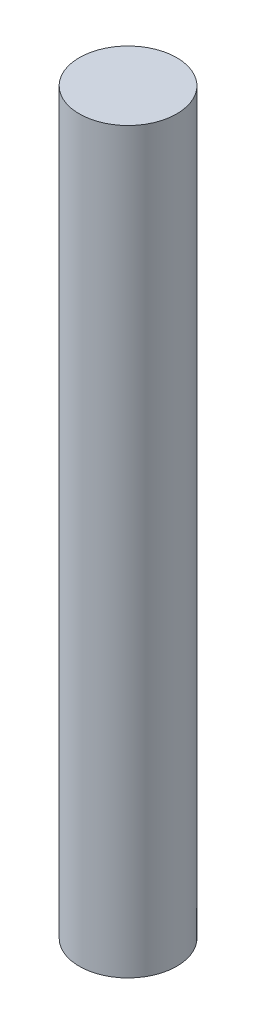
ISO-10303-21;
HEADER;
FILE_DESCRIPTION(('STEP AP214'),'2;1');
FILE_NAME('part.step','',(''),(''),'','','');
FILE_SCHEMA(('AUTOMOTIVE_DESIGN { 1 0 10303 214 1 1 1 1 }'));
ENDSEC;
DATA;
#1=APPLICATION_CONTEXT('core data for automotive mechanical design processes');
#2=APPLICATION_PROTOCOL_DEFINITION('international standard','automotive_design',2000,#1);
#3=PRODUCT_CONTEXT('',#1,'mechanical');
#4=PRODUCT('Part','Part','',(#3));
#5=PRODUCT_RELATED_PRODUCT_CATEGORY('part','',(#4));
#6=PRODUCT_DEFINITION_FORMATION('','',#4);
#7=PRODUCT_DEFINITION_CONTEXT('part definition',#1,'design');
#8=PRODUCT_DEFINITION('design','',#6,#7);
#9=PRODUCT_DEFINITION_SHAPE('','',#8);
#10=(LENGTH_UNIT() NAMED_UNIT(*) SI_UNIT(.MILLI.,.METRE.));
#11=(NAMED_UNIT(*) PLANE_ANGLE_UNIT() SI_UNIT($,.RADIAN.));
#12=(NAMED_UNIT(*) SI_UNIT($,.STERADIAN.) SOLID_ANGLE_UNIT());
#13=UNCERTAINTY_MEASURE_WITH_UNIT(LENGTH_MEASURE(1.E-05),#10,'distance_accuracy_value','');
#14=(GEOMETRIC_REPRESENTATION_CONTEXT(3) GLOBAL_UNCERTAINTY_ASSIGNED_CONTEXT((#13)) GLOBAL_UNIT_ASSIGNED_CONTEXT((#10,
#11,#12)) REPRESENTATION_CONTEXT('',''));
#15=CARTESIAN_POINT('',(0.,0.,0.));
#16=DIRECTION('',(0.,0.,1.));
#17=DIRECTION('',(1.,0.,0.));
#18=AXIS2_PLACEMENT_3D('',#15,#16,#17);
#19=CARTESIAN_POINT('',(0.,48.1,0.));
#20=DIRECTION('',(0.,-1.,0.));
#21=DIRECTION('',(0.,0.,-1.));
#22=AXIS2_PLACEMENT_3D('',#19,#20,#21);
#23=CYLINDRICAL_SURFACE('',#22,3.175);
#24=CARTESIAN_POINT('',(0.,48.1,0.));
#25=DIRECTION('',(0.,1.,0.));
#26=DIRECTION('',(0.,0.,1.));
#27=AXIS2_PLACEMENT_3D('',#24,#25,#26);
#28=CIRCLE('',#27,3.175);
#29=CARTESIAN_POINT('',(0.,48.1,-3.175));
#30=VERTEX_POINT('',#29);
#31=EDGE_CURVE('E10',#30,#30,#28,.T.);
#32=CARTESIAN_POINT('',(0.,0.,0.));
#33=DIRECTION('',(0.,1.,0.));
#34=DIRECTION('',(0.,0.,1.));
#35=AXIS2_PLACEMENT_3D('',#32,#33,#34);
#36=CIRCLE('',#35,3.175);
#37=CARTESIAN_POINT('',(0.,0.,-3.175));
#38=VERTEX_POINT('',#37);
#39=EDGE_CURVE('E38',#38,#38,#36,.T.);
#40=CARTESIAN_POINT('',(0.,48.1,-3.175));
#41=CARTESIAN_POINT('',(0.,47.5989583333333,-3.175));
#42=CARTESIAN_POINT('',(0.,47.0979166666667,-3.175));
#43=CARTESIAN_POINT('',(0.,46.0958333333333,-3.175));
#44=CARTESIAN_POINT('',(0.,45.5947916666667,-3.175));
#45=CARTESIAN_POINT('',(0.,44.5927083333333,-3.175));
#46=CARTESIAN_POINT('',(0.,44.0916666666667,-3.175));
#47=CARTESIAN_POINT('',(0.,43.0895833333333,-3.175));
#48=CARTESIAN_POINT('',(0.,42.5885416666667,-3.175));
#49=CARTESIAN_POINT('',(0.,41.5864583333333,-3.175));
#50=CARTESIAN_POINT('',(0.,41.0854166666667,-3.175));
#51=CARTESIAN_POINT('',(0.,40.0833333333333,-3.175));
#52=CARTESIAN_POINT('',(0.,39.5822916666667,-3.175));
#53=CARTESIAN_POINT('',(0.,38.5802083333333,-3.175));
#54=CARTESIAN_POINT('',(0.,38.0791666666667,-3.175));
#55=CARTESIAN_POINT('',(0.,37.0770833333333,-3.175));
#56=CARTESIAN_POINT('',(0.,36.5760416666667,-3.175));
#57=CARTESIAN_POINT('',(0.,35.5739583333333,-3.175));
#58=CARTESIAN_POINT('',(0.,35.0729166666667,-3.175));
#59=CARTESIAN_POINT('',(0.,34.0708333333333,-3.175));
#60=CARTESIAN_POINT('',(0.,33.5697916666667,-3.175));
#61=CARTESIAN_POINT('',(0.,32.5677083333333,-3.175));
#62=CARTESIAN_POINT('',(0.,32.0666666666667,-3.175));
#63=CARTESIAN_POINT('',(0.,31.0645833333333,-3.175));
#64=CARTESIAN_POINT('',(0.,30.5635416666667,-3.175));
#65=CARTESIAN_POINT('',(0.,29.5614583333333,-3.175));
#66=CARTESIAN_POINT('',(0.,29.0604166666667,-3.175));
#67=CARTESIAN_POINT('',(0.,28.0583333333333,-3.175));
#68=CARTESIAN_POINT('',(0.,27.5572916666667,-3.175));
#69=CARTESIAN_POINT('',(0.,26.5552083333333,-3.175));
#70=CARTESIAN_POINT('',(0.,26.0541666666667,-3.175));
#71=CARTESIAN_POINT('',(0.,25.0520833333333,-3.175));
#72=CARTESIAN_POINT('',(0.,24.5510416666667,-3.175));
#73=CARTESIAN_POINT('',(0.,23.5489583333333,-3.175));
#74=CARTESIAN_POINT('',(0.,23.0479166666667,-3.175));
#75=CARTESIAN_POINT('',(0.,22.0458333333333,-3.175));
#76=CARTESIAN_POINT('',(0.,21.5447916666667,-3.175));
#77=CARTESIAN_POINT('',(0.,20.5427083333333,-3.175));
#78=CARTESIAN_POINT('',(0.,20.0416666666667,-3.175));
#79=CARTESIAN_POINT('',(0.,19.0395833333333,-3.175));
#80=CARTESIAN_POINT('',(0.,18.5385416666667,-3.175));
#81=CARTESIAN_POINT('',(0.,17.5364583333333,-3.175));
#82=CARTESIAN_POINT('',(0.,17.0354166666667,-3.175));
#83=CARTESIAN_POINT('',(0.,16.0333333333333,-3.175));
#84=CARTESIAN_POINT('',(0.,15.5322916666667,-3.175));
#85=CARTESIAN_POINT('',(0.,14.5302083333333,-3.175));
#86=CARTESIAN_POINT('',(0.,14.0291666666667,-3.175));
#87=CARTESIAN_POINT('',(0.,13.0270833333333,-3.175));
#88=CARTESIAN_POINT('',(0.,12.5260416666667,-3.175));
#89=CARTESIAN_POINT('',(0.,11.5239583333333,-3.175));
#90=CARTESIAN_POINT('',(0.,11.0229166666667,-3.175));
#91=CARTESIAN_POINT('',(0.,10.0208333333333,-3.175));
#92=CARTESIAN_POINT('',(0.,9.51979166666667,-3.175));
#93=CARTESIAN_POINT('',(0.,8.51770833333333,-3.175));
#94=CARTESIAN_POINT('',(0.,8.01666666666667,-3.175));
#95=CARTESIAN_POINT('',(0.,7.01458333333333,-3.175));
#96=CARTESIAN_POINT('',(0.,6.51354166666666,-3.175));
#97=CARTESIAN_POINT('',(0.,5.51145833333333,-3.175));
#98=CARTESIAN_POINT('',(0.,5.01041666666666,-3.175));
#99=CARTESIAN_POINT('',(0.,4.00833333333333,-3.175));
#100=CARTESIAN_POINT('',(0.,3.50729166666666,-3.175));
#101=CARTESIAN_POINT('',(0.,2.50520833333333,-3.175));
#102=CARTESIAN_POINT('',(0.,2.00416666666666,-3.175));
#103=CARTESIAN_POINT('',(0.,1.00208333333333,-3.175));
#104=CARTESIAN_POINT('',(0.,0.50104166666666,-3.175));
#105=CARTESIAN_POINT('',(0.,0.,-3.175));
#106=B_SPLINE_CURVE_WITH_KNOTS('',3,(#40,#41,#42,#43,#44,#45,#46,#47,#48,#49,#50,#51,#52,#53,
#54,#55,#56,#57,#58,#59,#60,#61,#62,#63,#64,#65,#66,#67,#68,#69,#70,#71,#72,#73,#74,#75,#76,#77,
#78,#79,#80,#81,#82,#83,#84,#85,#86,#87,#88,#89,#90,#91,#92,#93,#94,#95,#96,#97,#98,#99,#100,
#101,#102,#103,#104,#105),.UNSPECIFIED.,.F.,.F.,(4,2,2,2,2,2,2,2,2,2,2,2,2,2,2,2,2,2,2,2,2,2,2,
2,2,2,2,2,2,2,2,2,4),(0.,1.503125,3.00625,4.509375,6.0125,7.51562500000001,9.01875000000001,
10.521875,12.025,13.528125,15.03125,16.534375,18.0375,19.540625,21.04375,22.546875,24.05,
25.553125,27.05625,28.559375,30.0625,31.565625,33.06875,34.571875,36.075,37.578125,39.08125,
40.584375,42.0875,43.590625,45.09375,46.596875,48.1),.UNSPECIFIED.);
#107=EDGE_CURVE('BSEAM35',#30,#38,#106,.T.);
#108=ORIENTED_EDGE('',*,*,#31,.F.);
#109=ORIENTED_EDGE('',*,*,#39,.T.);
#110=ORIENTED_EDGE('',*,*,#107,.T.);
#111=ORIENTED_EDGE('',*,*,#107,.F.);
#112=EDGE_LOOP('',(#108,#110,#109,#111));
#113=FACE_BOUND('',#112,.T.);
#114=ADVANCED_FACE('F35',(#113),#23,.T.);
#115=CARTESIAN_POINT('',(0.,48.1,0.));
#116=DIRECTION('',(0.,1.,0.));
#117=DIRECTION('',(0.,0.,1.));
#118=AXIS2_PLACEMENT_3D('',#115,#116,#117);
#119=PLANE('',#118);
#120=ORIENTED_EDGE('',*,*,#31,.T.);
#121=EDGE_LOOP('',(#120));
#122=FACE_BOUND('',#121,.T.);
#123=ADVANCED_FACE('F50',(#122),#119,.T.);
#124=CARTESIAN_POINT('',(0.,0.,0.));
#125=DIRECTION('',(0.,1.,0.));
#126=DIRECTION('',(0.,0.,1.));
#127=AXIS2_PLACEMENT_3D('',#124,#125,#126);
#128=PLANE('',#127);
#129=ORIENTED_EDGE('',*,*,#39,.F.);
#130=EDGE_LOOP('',(#129));
#131=FACE_BOUND('',#130,.T.);
#132=ADVANCED_FACE('F48',(#131),#128,.F.);
#133=CLOSED_SHELL('',(#114,#123,#132));
#134=MANIFOLD_SOLID_BREP('B2',#133);
#135=ADVANCED_BREP_SHAPE_REPRESENTATION('',(#18,#134),#14);
#136=SHAPE_DEFINITION_REPRESENTATION(#9,#135);
ENDSEC;
END-ISO-10303-21;
